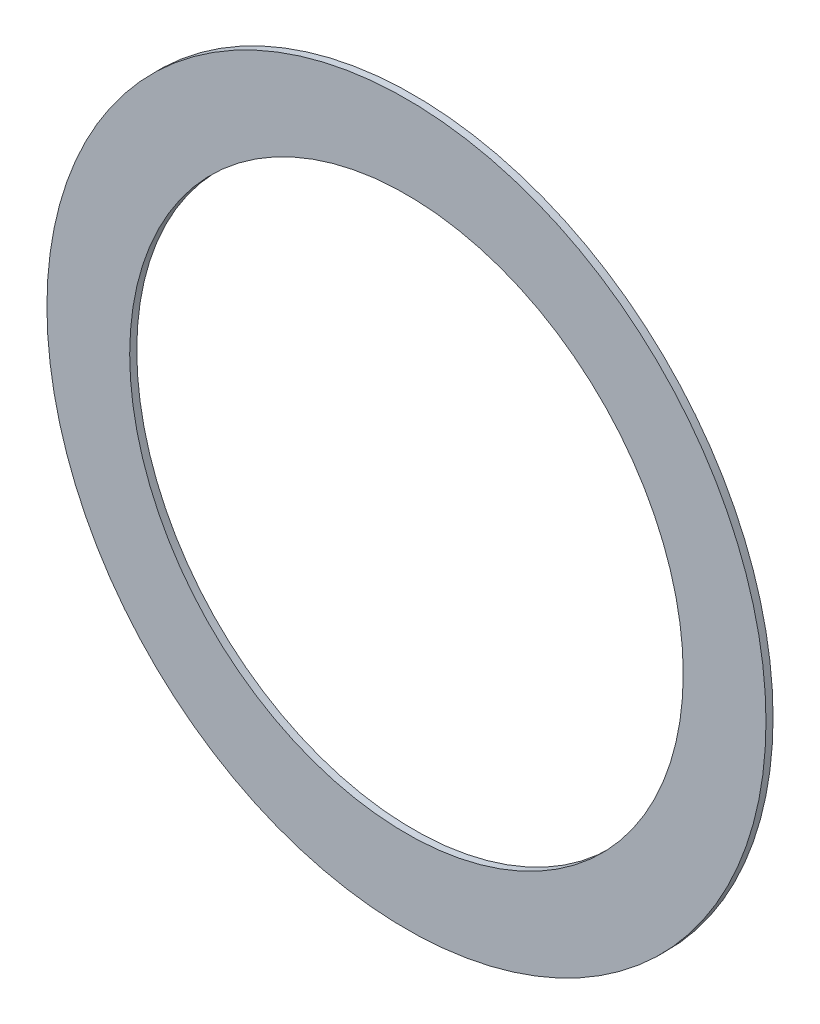
ISO-10303-21;
HEADER;
FILE_DESCRIPTION(('STEP AP214'),'2;1');
FILE_NAME('part.step','',(''),(''),'','','');
FILE_SCHEMA(('AUTOMOTIVE_DESIGN { 1 0 10303 214 1 1 1 1 }'));
ENDSEC;
DATA;
#1=APPLICATION_CONTEXT('core data for automotive mechanical design processes');
#2=APPLICATION_PROTOCOL_DEFINITION('international standard','automotive_design',2000,#1);
#3=PRODUCT_CONTEXT('',#1,'mechanical');
#4=PRODUCT('Part','Part','',(#3));
#5=PRODUCT_RELATED_PRODUCT_CATEGORY('part','',(#4));
#6=PRODUCT_DEFINITION_FORMATION('','',#4);
#7=PRODUCT_DEFINITION_CONTEXT('part definition',#1,'design');
#8=PRODUCT_DEFINITION('design','',#6,#7);
#9=PRODUCT_DEFINITION_SHAPE('','',#8);
#10=(LENGTH_UNIT() NAMED_UNIT(*) SI_UNIT(.MILLI.,.METRE.));
#11=(NAMED_UNIT(*) PLANE_ANGLE_UNIT() SI_UNIT($,.RADIAN.));
#12=(NAMED_UNIT(*) SI_UNIT($,.STERADIAN.) SOLID_ANGLE_UNIT());
#13=UNCERTAINTY_MEASURE_WITH_UNIT(LENGTH_MEASURE(1.E-05),#10,'distance_accuracy_value','');
#14=(GEOMETRIC_REPRESENTATION_CONTEXT(3) GLOBAL_UNCERTAINTY_ASSIGNED_CONTEXT((#13)) GLOBAL_UNIT_ASSIGNED_CONTEXT((#10,
#11,#12)) REPRESENTATION_CONTEXT('',''));
#15=CARTESIAN_POINT('',(0.,0.,0.));
#16=DIRECTION('',(0.,0.,1.));
#17=DIRECTION('',(1.,0.,0.));
#18=AXIS2_PLACEMENT_3D('',#15,#16,#17);
#19=CARTESIAN_POINT('',(0.,0.,-0.406399999999998));
#20=DIRECTION('',(0.,0.,1.));
#21=DIRECTION('',(1.,0.,0.));
#22=AXIS2_PLACEMENT_3D('',#19,#20,#21);
#23=CYLINDRICAL_SURFACE('',#22,41.275);
#24=CARTESIAN_POINT('',(0.,0.,-0.406399999999998));
#25=DIRECTION('',(0.,0.,1.));
#26=DIRECTION('',(1.,0.,0.));
#27=AXIS2_PLACEMENT_3D('',#24,#25,#26);
#28=CIRCLE('',#27,41.275);
#29=CARTESIAN_POINT('',(41.275,0.,-0.406399999999998));
#30=VERTEX_POINT('',#29);
#31=EDGE_CURVE('E10',#30,#30,#28,.T.);
#32=ORIENTED_EDGE('',*,*,#31,.T.);
#33=EDGE_LOOP('',(#32));
#34=FACE_BOUND('',#33,.T.);
#35=CARTESIAN_POINT('',(0.,0.,0.406400000000002));
#36=DIRECTION('',(0.,0.,1.));
#37=DIRECTION('',(1.,0.,0.));
#38=AXIS2_PLACEMENT_3D('',#35,#36,#37);
#39=CIRCLE('',#38,41.275);
#40=CARTESIAN_POINT('',(41.275,0.,0.406400000000002));
#41=VERTEX_POINT('',#40);
#42=EDGE_CURVE('E56',#41,#41,#39,.T.);
#43=ORIENTED_EDGE('',*,*,#42,.F.);
#44=EDGE_LOOP('',(#43));
#45=FACE_BOUND('',#44,.T.);
#46=ADVANCED_FACE('F43',(#34,#45),#23,.T.);
#47=CARTESIAN_POINT('',(0.,0.,-0.406399999999998));
#48=DIRECTION('',(0.,0.,1.));
#49=DIRECTION('',(1.,0.,0.));
#50=AXIS2_PLACEMENT_3D('',#47,#48,#49);
#51=PLANE('',#50);
#52=CARTESIAN_POINT('',(0.,0.,-0.406399999999998));
#53=DIRECTION('',(0.,0.,1.));
#54=DIRECTION('',(1.,0.,0.));
#55=AXIS2_PLACEMENT_3D('',#52,#53,#54);
#56=CIRCLE('',#55,31.7754);
#57=CARTESIAN_POINT('',(31.7754,0.,-0.406399999999998));
#58=VERTEX_POINT('',#57);
#59=EDGE_CURVE('E50',#58,#58,#56,.T.);
#60=ORIENTED_EDGE('',*,*,#59,.T.);
#61=EDGE_LOOP('',(#60));
#62=FACE_BOUND('',#61,.T.);
#63=ORIENTED_EDGE('',*,*,#31,.F.);
#64=EDGE_LOOP('',(#63));
#65=FACE_BOUND('',#64,.T.);
#66=ADVANCED_FACE('F79',(#62,#65),#51,.F.);
#67=CARTESIAN_POINT('',(0.,0.,-0.406399999999998));
#68=DIRECTION('',(0.,0.,1.));
#69=DIRECTION('',(1.,0.,0.));
#70=AXIS2_PLACEMENT_3D('',#67,#68,#69);
#71=CYLINDRICAL_SURFACE('',#70,31.7754);
#72=ORIENTED_EDGE('',*,*,#59,.F.);
#73=EDGE_LOOP('',(#72));
#74=FACE_BOUND('',#73,.T.);
#75=CARTESIAN_POINT('',(0.,0.,0.406400000000002));
#76=DIRECTION('',(0.,0.,1.));
#77=DIRECTION('',(1.,0.,0.));
#78=AXIS2_PLACEMENT_3D('',#75,#76,#77);
#79=CIRCLE('',#78,31.7754);
#80=CARTESIAN_POINT('',(31.7754,0.,0.406400000000002));
#81=VERTEX_POINT('',#80);
#82=EDGE_CURVE('E62',#81,#81,#79,.T.);
#83=ORIENTED_EDGE('',*,*,#82,.T.);
#84=EDGE_LOOP('',(#83));
#85=FACE_BOUND('',#84,.T.);
#86=ADVANCED_FACE('F70',(#74,#85),#71,.F.);
#87=CARTESIAN_POINT('',(0.,0.,0.406400000000002));
#88=DIRECTION('',(0.,0.,1.));
#89=DIRECTION('',(1.,0.,0.));
#90=AXIS2_PLACEMENT_3D('',#87,#88,#89);
#91=PLANE('',#90);
#92=ORIENTED_EDGE('',*,*,#42,.T.);
#93=EDGE_LOOP('',(#92));
#94=FACE_BOUND('',#93,.T.);
#95=ORIENTED_EDGE('',*,*,#82,.F.);
#96=EDGE_LOOP('',(#95));
#97=FACE_BOUND('',#96,.T.);
#98=ADVANCED_FACE('F72',(#94,#97),#91,.T.);
#99=CLOSED_SHELL('',(#46,#66,#86,#98));
#100=MANIFOLD_SOLID_BREP('B2',#99);
#101=ADVANCED_BREP_SHAPE_REPRESENTATION('',(#18,#100),#14);
#102=SHAPE_DEFINITION_REPRESENTATION(#9,#101);
ENDSEC;
END-ISO-10303-21;
